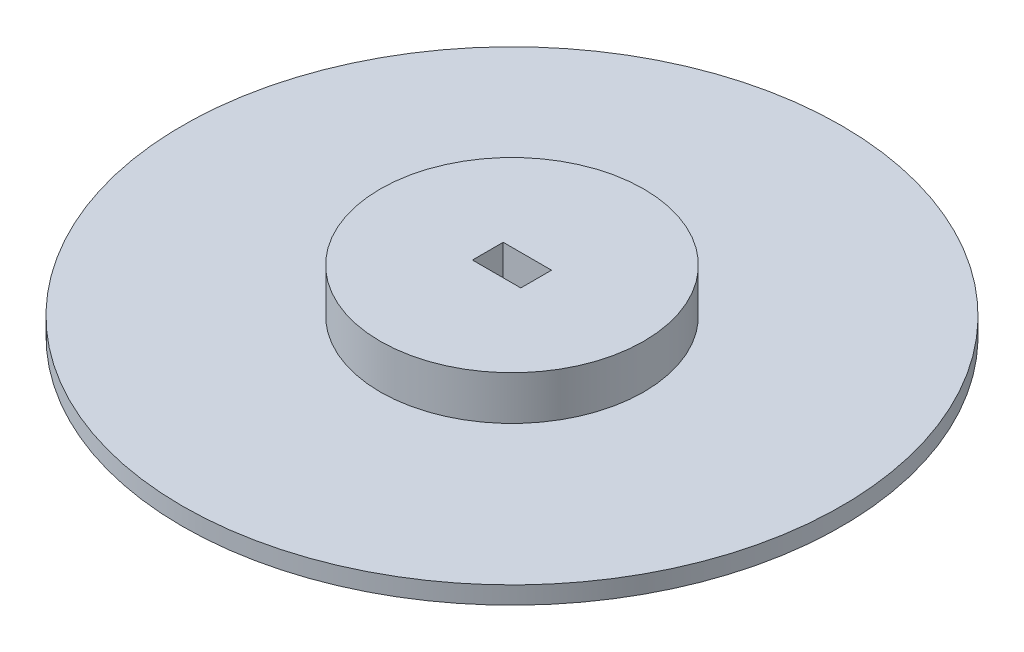
ISO-10303-21;
HEADER;
FILE_DESCRIPTION(('STEP AP214'),'2;1');
FILE_NAME('part.step','',(''),(''),'','','');
FILE_SCHEMA(('AUTOMOTIVE_DESIGN { 1 0 10303 214 1 1 1 1 }'));
ENDSEC;
DATA;
#1=APPLICATION_CONTEXT('core data for automotive mechanical design processes');
#2=APPLICATION_PROTOCOL_DEFINITION('international standard','automotive_design',2000,#1);
#3=PRODUCT_CONTEXT('',#1,'mechanical');
#4=PRODUCT('Part','Part','',(#3));
#5=PRODUCT_RELATED_PRODUCT_CATEGORY('part','',(#4));
#6=PRODUCT_DEFINITION_FORMATION('','',#4);
#7=PRODUCT_DEFINITION_CONTEXT('part definition',#1,'design');
#8=PRODUCT_DEFINITION('design','',#6,#7);
#9=PRODUCT_DEFINITION_SHAPE('','',#8);
#10=(LENGTH_UNIT() NAMED_UNIT(*) SI_UNIT(.MILLI.,.METRE.));
#11=(NAMED_UNIT(*) PLANE_ANGLE_UNIT() SI_UNIT($,.RADIAN.));
#12=(NAMED_UNIT(*) SI_UNIT($,.STERADIAN.) SOLID_ANGLE_UNIT());
#13=UNCERTAINTY_MEASURE_WITH_UNIT(LENGTH_MEASURE(1.E-05),#10,'distance_accuracy_value','');
#14=(GEOMETRIC_REPRESENTATION_CONTEXT(3) GLOBAL_UNCERTAINTY_ASSIGNED_CONTEXT((#13)) GLOBAL_UNIT_ASSIGNED_CONTEXT((#10,
#11,#12)) REPRESENTATION_CONTEXT('',''));
#15=CARTESIAN_POINT('',(0.,0.,0.));
#16=DIRECTION('',(0.,0.,1.));
#17=DIRECTION('',(1.,0.,0.));
#18=AXIS2_PLACEMENT_3D('',#15,#16,#17);
#19=CARTESIAN_POINT('',(0.,7.,0.));
#20=DIRECTION('',(0.,-1.,0.));
#21=DIRECTION('',(0.,0.,-1.));
#22=AXIS2_PLACEMENT_3D('',#19,#20,#21);
#23=CYLINDRICAL_SURFACE('',#22,15.);
#24=CARTESIAN_POINT('',(0.,7.,0.));
#25=DIRECTION('',(0.,1.,0.));
#26=DIRECTION('',(0.,0.,1.));
#27=AXIS2_PLACEMENT_3D('',#24,#25,#26);
#28=CIRCLE('',#27,15.);
#29=CARTESIAN_POINT('',(0.,7.,15.));
#30=VERTEX_POINT('',#29);
#31=EDGE_CURVE('E43',#30,#30,#28,.T.);
#32=ORIENTED_EDGE('',*,*,#31,.F.);
#33=EDGE_LOOP('',(#32));
#34=FACE_BOUND('',#33,.T.);
#35=CARTESIAN_POINT('',(0.,2.,0.));
#36=DIRECTION('',(0.,-1.,0.));
#37=DIRECTION('',(0.,0.,-1.));
#38=AXIS2_PLACEMENT_3D('',#35,#36,#37);
#39=CIRCLE('',#38,15.);
#40=CARTESIAN_POINT('',(0.,2.,-15.));
#41=VERTEX_POINT('',#40);
#42=EDGE_CURVE('E11',#41,#41,#39,.T.);
#43=ORIENTED_EDGE('',*,*,#42,.F.);
#44=EDGE_LOOP('',(#43));
#45=FACE_BOUND('',#44,.T.);
#46=ADVANCED_FACE('F36',(#34,#45),#23,.T.);
#47=CARTESIAN_POINT('',(0.,7.,0.));
#48=DIRECTION('',(0.,1.,0.));
#49=DIRECTION('',(0.,0.,1.));
#50=AXIS2_PLACEMENT_3D('',#47,#48,#49);
#51=PLANE('',#50);
#52=DIRECTION('',(1.,0.,0.));
#53=VECTOR('',#52,1.);
#54=CARTESIAN_POINT('',(-2.75,7.,1.75));
#55=LINE('',#54,#53);
#56=CARTESIAN_POINT('',(-2.75,7.,1.75));
#57=VERTEX_POINT('',#56);
#58=CARTESIAN_POINT('',(2.75,7.,1.75));
#59=VERTEX_POINT('',#58);
#60=EDGE_CURVE('E50',#57,#59,#55,.T.);
#61=ORIENTED_EDGE('',*,*,#60,.F.);
#62=DIRECTION('',(0.,0.,1.));
#63=VECTOR('',#62,1.);
#64=CARTESIAN_POINT('',(-2.75,7.,1.75));
#65=LINE('',#64,#63);
#66=CARTESIAN_POINT('',(-2.75,7.,-1.75));
#67=VERTEX_POINT('',#66);
#68=EDGE_CURVE('E94',#67,#57,#65,.T.);
#69=ORIENTED_EDGE('',*,*,#68,.F.);
#70=DIRECTION('',(-1.,0.,0.));
#71=VECTOR('',#70,1.);
#72=CARTESIAN_POINT('',(-2.75,7.,-1.75));
#73=LINE('',#72,#71);
#74=CARTESIAN_POINT('',(2.75,7.,-1.75));
#75=VERTEX_POINT('',#74);
#76=EDGE_CURVE('E97',#75,#67,#73,.T.);
#77=ORIENTED_EDGE('',*,*,#76,.F.);
#78=DIRECTION('',(0.,0.,-1.));
#79=VECTOR('',#78,1.);
#80=CARTESIAN_POINT('',(2.75,7.,1.75));
#81=LINE('',#80,#79);
#82=EDGE_CURVE('E106',#59,#75,#81,.T.);
#83=ORIENTED_EDGE('',*,*,#82,.F.);
#84=EDGE_LOOP('',(#61,#69,#77,#83));
#85=FACE_BOUND('',#84,.T.);
#86=ORIENTED_EDGE('',*,*,#31,.T.);
#87=EDGE_LOOP('',(#86));
#88=FACE_BOUND('',#87,.T.);
#89=ADVANCED_FACE('F118',(#85,#88),#51,.T.);
#90=CARTESIAN_POINT('',(0.,0.,0.));
#91=DIRECTION('',(0.,1.,0.));
#92=DIRECTION('',(0.,0.,1.));
#93=AXIS2_PLACEMENT_3D('',#90,#91,#92);
#94=PLANE('',#93);
#95=DIRECTION('',(0.,0.,1.));
#96=VECTOR('',#95,1.);
#97=CARTESIAN_POINT('',(-2.75,0.,1.75));
#98=LINE('',#97,#96);
#99=CARTESIAN_POINT('',(-2.75,0.,-1.75));
#100=VERTEX_POINT('',#99);
#101=CARTESIAN_POINT('',(-2.75,0.,1.75));
#102=VERTEX_POINT('',#101);
#103=EDGE_CURVE('E84',#100,#102,#98,.T.);
#104=ORIENTED_EDGE('',*,*,#103,.T.);
#105=DIRECTION('',(1.,0.,0.));
#106=VECTOR('',#105,1.);
#107=CARTESIAN_POINT('',(-2.75,0.,1.75));
#108=LINE('',#107,#106);
#109=CARTESIAN_POINT('',(2.75,0.,1.75));
#110=VERTEX_POINT('',#109);
#111=EDGE_CURVE('E78',#102,#110,#108,.T.);
#112=ORIENTED_EDGE('',*,*,#111,.T.);
#113=DIRECTION('',(0.,0.,-1.));
#114=VECTOR('',#113,1.);
#115=CARTESIAN_POINT('',(2.75,0.,1.75));
#116=LINE('',#115,#114);
#117=CARTESIAN_POINT('',(2.75,0.,-1.75));
#118=VERTEX_POINT('',#117);
#119=EDGE_CURVE('E87',#110,#118,#116,.T.);
#120=ORIENTED_EDGE('',*,*,#119,.T.);
#121=DIRECTION('',(-1.,0.,0.));
#122=VECTOR('',#121,1.);
#123=CARTESIAN_POINT('',(-2.75,0.,-1.75));
#124=LINE('',#123,#122);
#125=EDGE_CURVE('E58',#118,#100,#124,.T.);
#126=ORIENTED_EDGE('',*,*,#125,.T.);
#127=EDGE_LOOP('',(#104,#112,#120,#126));
#128=FACE_BOUND('',#127,.T.);
#129=CARTESIAN_POINT('',(0.,0.,0.));
#130=DIRECTION('',(0.,-1.,0.));
#131=DIRECTION('',(0.,0.,-1.));
#132=AXIS2_PLACEMENT_3D('',#129,#130,#131);
#133=CIRCLE('',#132,37.5);
#134=CARTESIAN_POINT('',(0.,0.,-37.5));
#135=VERTEX_POINT('',#134);
#136=EDGE_CURVE('E100',#135,#135,#133,.T.);
#137=ORIENTED_EDGE('',*,*,#136,.T.);
#138=EDGE_LOOP('',(#137));
#139=FACE_BOUND('',#138,.T.);
#140=ADVANCED_FACE('F91',(#128,#139),#94,.F.);
#141=CARTESIAN_POINT('',(-2.75,0.,1.75));
#142=DIRECTION('',(0.,0.,1.));
#143=DIRECTION('',(1.,0.,0.));
#144=AXIS2_PLACEMENT_3D('',#141,#142,#143);
#145=PLANE('',#144);
#146=ORIENTED_EDGE('',*,*,#60,.T.);
#147=DIRECTION('',(0.,1.,0.));
#148=VECTOR('',#147,1.);
#149=CARTESIAN_POINT('',(2.75,0.,1.75));
#150=LINE('',#149,#148);
#151=EDGE_CURVE('E74',#110,#59,#150,.T.);
#152=ORIENTED_EDGE('',*,*,#151,.F.);
#153=ORIENTED_EDGE('',*,*,#111,.F.);
#154=DIRECTION('',(0.,1.,0.));
#155=VECTOR('',#154,1.);
#156=CARTESIAN_POINT('',(-2.75,0.,1.75));
#157=LINE('',#156,#155);
#158=EDGE_CURVE('E111',#102,#57,#157,.T.);
#159=ORIENTED_EDGE('',*,*,#158,.T.);
#160=EDGE_LOOP('',(#146,#152,#153,#159));
#161=FACE_BOUND('',#160,.T.);
#162=ADVANCED_FACE('F76',(#161),#145,.F.);
#163=CARTESIAN_POINT('',(-2.75,0.,1.75));
#164=DIRECTION('',(-1.,0.,0.));
#165=DIRECTION('',(0.,0.,1.));
#166=AXIS2_PLACEMENT_3D('',#163,#164,#165);
#167=PLANE('',#166);
#168=ORIENTED_EDGE('',*,*,#68,.T.);
#169=ORIENTED_EDGE('',*,*,#158,.F.);
#170=ORIENTED_EDGE('',*,*,#103,.F.);
#171=DIRECTION('',(0.,1.,0.));
#172=VECTOR('',#171,1.);
#173=CARTESIAN_POINT('',(-2.75,0.,-1.75));
#174=LINE('',#173,#172);
#175=EDGE_CURVE('E113',#100,#67,#174,.T.);
#176=ORIENTED_EDGE('',*,*,#175,.T.);
#177=EDGE_LOOP('',(#168,#169,#170,#176));
#178=FACE_BOUND('',#177,.T.);
#179=ADVANCED_FACE('F143',(#178),#167,.F.);
#180=CARTESIAN_POINT('',(-2.75,0.,-1.75));
#181=DIRECTION('',(0.,0.,-1.));
#182=DIRECTION('',(-1.,0.,0.));
#183=AXIS2_PLACEMENT_3D('',#180,#181,#182);
#184=PLANE('',#183);
#185=ORIENTED_EDGE('',*,*,#76,.T.);
#186=ORIENTED_EDGE('',*,*,#175,.F.);
#187=ORIENTED_EDGE('',*,*,#125,.F.);
#188=DIRECTION('',(0.,1.,0.));
#189=VECTOR('',#188,1.);
#190=CARTESIAN_POINT('',(2.75,0.,-1.75));
#191=LINE('',#190,#189);
#192=EDGE_CURVE('E83',#118,#75,#191,.T.);
#193=ORIENTED_EDGE('',*,*,#192,.T.);
#194=EDGE_LOOP('',(#185,#186,#187,#193));
#195=FACE_BOUND('',#194,.T.);
#196=ADVANCED_FACE('F140',(#195),#184,.F.);
#197=CARTESIAN_POINT('',(2.75,0.,1.75));
#198=DIRECTION('',(1.,0.,0.));
#199=DIRECTION('',(0.,0.,-1.));
#200=AXIS2_PLACEMENT_3D('',#197,#198,#199);
#201=PLANE('',#200);
#202=ORIENTED_EDGE('',*,*,#82,.T.);
#203=ORIENTED_EDGE('',*,*,#192,.F.);
#204=ORIENTED_EDGE('',*,*,#119,.F.);
#205=ORIENTED_EDGE('',*,*,#151,.T.);
#206=EDGE_LOOP('',(#202,#203,#204,#205));
#207=FACE_BOUND('',#206,.T.);
#208=ADVANCED_FACE('F88',(#207),#201,.F.);
#209=CARTESIAN_POINT('',(0.,2.,0.));
#210=DIRECTION('',(0.,-1.,0.));
#211=DIRECTION('',(0.,0.,-1.));
#212=AXIS2_PLACEMENT_3D('',#209,#210,#211);
#213=CYLINDRICAL_SURFACE('',#212,37.5);
#214=CARTESIAN_POINT('',(0.,2.,0.));
#215=DIRECTION('',(0.,-1.,0.));
#216=DIRECTION('',(0.,0.,-1.));
#217=AXIS2_PLACEMENT_3D('',#214,#215,#216);
#218=CIRCLE('',#217,37.5);
#219=CARTESIAN_POINT('',(0.,2.,-37.5));
#220=VERTEX_POINT('',#219);
#221=EDGE_CURVE('E107',#220,#220,#218,.T.);
#222=ORIENTED_EDGE('',*,*,#221,.T.);
#223=EDGE_LOOP('',(#222));
#224=FACE_BOUND('',#223,.T.);
#225=ORIENTED_EDGE('',*,*,#136,.F.);
#226=EDGE_LOOP('',(#225));
#227=FACE_BOUND('',#226,.T.);
#228=ADVANCED_FACE('F127',(#224,#227),#213,.T.);
#229=CARTESIAN_POINT('',(0.,2.,0.));
#230=DIRECTION('',(0.,-1.,0.));
#231=DIRECTION('',(0.,0.,-1.));
#232=AXIS2_PLACEMENT_3D('',#229,#230,#231);
#233=PLANE('',#232);
#234=ORIENTED_EDGE('',*,*,#42,.T.);
#235=EDGE_LOOP('',(#234));
#236=FACE_BOUND('',#235,.T.);
#237=ORIENTED_EDGE('',*,*,#221,.F.);
#238=EDGE_LOOP('',(#237));
#239=FACE_BOUND('',#238,.T.);
#240=ADVANCED_FACE('F124',(#236,#239),#233,.F.);
#241=CLOSED_SHELL('',(#46,#89,#140,#162,#179,#196,#208,#228,#240));
#242=MANIFOLD_SOLID_BREP('B2',#241);
#243=ADVANCED_BREP_SHAPE_REPRESENTATION('',(#18,#242),#14);
#244=SHAPE_DEFINITION_REPRESENTATION(#9,#243);
ENDSEC;
END-ISO-10303-21;
